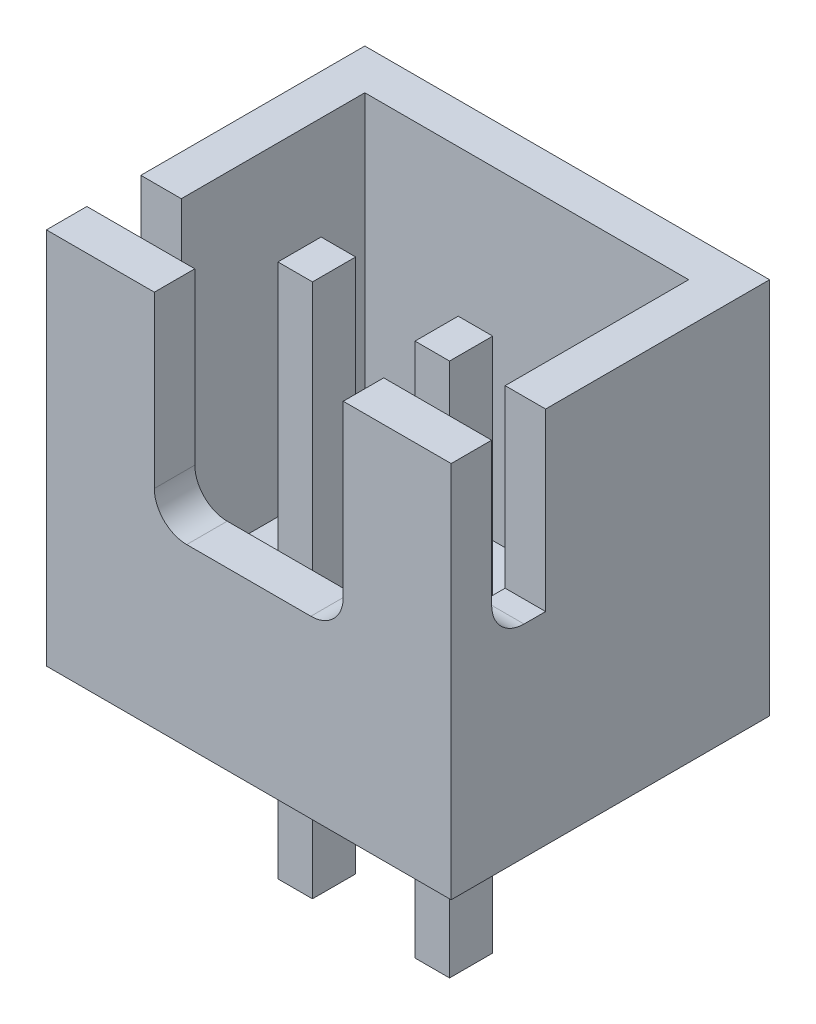
ISO-10303-21;
HEADER;
FILE_DESCRIPTION(('STEP AP214'),'2;1');
FILE_NAME('part.step','',(''),(''),'','','');
FILE_SCHEMA(('AUTOMOTIVE_DESIGN { 1 0 10303 214 1 1 1 1 }'));
ENDSEC;
DATA;
#1=APPLICATION_CONTEXT('core data for automotive mechanical design processes');
#2=APPLICATION_PROTOCOL_DEFINITION('international standard','automotive_design',2000,#1);
#3=PRODUCT_CONTEXT('',#1,'mechanical');
#4=PRODUCT('Part','Part','',(#3));
#5=PRODUCT_RELATED_PRODUCT_CATEGORY('part','',(#4));
#6=PRODUCT_DEFINITION_FORMATION('','',#4);
#7=PRODUCT_DEFINITION_CONTEXT('part definition',#1,'design');
#8=PRODUCT_DEFINITION('design','',#6,#7);
#9=PRODUCT_DEFINITION_SHAPE('','',#8);
#10=(LENGTH_UNIT() NAMED_UNIT(*) SI_UNIT(.MILLI.,.METRE.));
#11=(NAMED_UNIT(*) PLANE_ANGLE_UNIT() SI_UNIT($,.RADIAN.));
#12=(NAMED_UNIT(*) SI_UNIT($,.STERADIAN.) SOLID_ANGLE_UNIT());
#13=UNCERTAINTY_MEASURE_WITH_UNIT(LENGTH_MEASURE(1.E-05),#10,'distance_accuracy_value','');
#14=(GEOMETRIC_REPRESENTATION_CONTEXT(3) GLOBAL_UNCERTAINTY_ASSIGNED_CONTEXT((#13)) GLOBAL_UNIT_ASSIGNED_CONTEXT((#10,
#11,#12)) REPRESENTATION_CONTEXT('',''));
#15=CARTESIAN_POINT('',(0.,0.,0.));
#16=DIRECTION('',(0.,0.,1.));
#17=DIRECTION('',(1.,0.,0.));
#18=AXIS2_PLACEMENT_3D('',#15,#16,#17);
#19=CARTESIAN_POINT('',(0.,7.,0.));
#20=DIRECTION('',(0.,1.,0.));
#21=DIRECTION('',(0.,0.,1.));
#22=AXIS2_PLACEMENT_3D('',#19,#20,#21);
#23=PLANE('',#22);
#24=DIRECTION('',(1.,0.,0.));
#25=VECTOR('',#24,1.);
#26=CARTESIAN_POINT('',(-2.48,7.,2.53));
#27=LINE('',#26,#25);
#28=CARTESIAN_POINT('',(-2.48,7.,2.53));
#29=VERTEX_POINT('',#28);
#30=CARTESIAN_POINT('',(-0.48,7.,2.53));
#31=VERTEX_POINT('',#30);
#32=EDGE_CURVE('E551',#29,#31,#27,.T.);
#33=ORIENTED_EDGE('',*,*,#32,.T.);
#34=DIRECTION('',(0.,0.,1.));
#35=VECTOR('',#34,1.);
#36=CARTESIAN_POINT('',(-0.48,7.,0.53));
#37=LINE('',#36,#35);
#38=CARTESIAN_POINT('',(-0.48,7.,1.78));
#39=VERTEX_POINT('',#38);
#40=EDGE_CURVE('E428',#39,#31,#37,.T.);
#41=ORIENTED_EDGE('',*,*,#40,.F.);
#42=DIRECTION('',(1.,0.,0.));
#43=VECTOR('',#42,1.);
#44=CARTESIAN_POINT('',(-1.73,7.,1.78));
#45=LINE('',#44,#43);
#46=CARTESIAN_POINT('',(-2.48,7.,1.78));
#47=VERTEX_POINT('',#46);
#48=EDGE_CURVE('E510',#47,#39,#45,.T.);
#49=ORIENTED_EDGE('',*,*,#48,.F.);
#50=DIRECTION('',(0.,0.,1.));
#51=VECTOR('',#50,1.);
#52=CARTESIAN_POINT('',(-2.48,7.,-3.37));
#53=LINE('',#52,#51);
#54=EDGE_CURVE('E545',#47,#29,#53,.T.);
#55=ORIENTED_EDGE('',*,*,#54,.T.);
#56=EDGE_LOOP('',(#33,#41,#49,#55));
#57=FACE_BOUND('',#56,.T.);
#58=ADVANCED_FACE('F39',(#57),#23,.T.);
#59=CARTESIAN_POINT('',(5.02,1.,2.53));
#60=DIRECTION('',(0.,0.,-1.));
#61=DIRECTION('',(-1.,0.,0.));
#62=AXIS2_PLACEMENT_3D('',#59,#60,#61);
#63=PLANE('',#62);
#64=DIRECTION('',(0.,1.,0.));
#65=VECTOR('',#64,1.);
#66=CARTESIAN_POINT('',(-0.479999999999999,0.,2.53));
#67=LINE('',#66,#65);
#68=CARTESIAN_POINT('',(-0.48,3.85,2.53));
#69=VERTEX_POINT('',#68);
#70=EDGE_CURVE('E412',#69,#31,#67,.T.);
#71=ORIENTED_EDGE('',*,*,#70,.T.);
#72=ORIENTED_EDGE('',*,*,#32,.F.);
#73=DIRECTION('',(0.,-1.,0.));
#74=VECTOR('',#73,1.);
#75=CARTESIAN_POINT('',(-2.48,1.,2.53));
#76=LINE('',#75,#74);
#77=CARTESIAN_POINT('',(-2.48,0.,2.53));
#78=VERTEX_POINT('',#77);
#79=EDGE_CURVE('E646',#29,#78,#76,.T.);
#80=ORIENTED_EDGE('',*,*,#79,.T.);
#81=DIRECTION('',(1.,0.,0.));
#82=VECTOR('',#81,1.);
#83=CARTESIAN_POINT('',(5.02,0.,2.53));
#84=LINE('',#83,#82);
#85=CARTESIAN_POINT('',(5.02,0.,2.53));
#86=VERTEX_POINT('',#85);
#87=EDGE_CURVE('E625',#78,#86,#84,.T.);
#88=ORIENTED_EDGE('',*,*,#87,.T.);
#89=DIRECTION('',(0.,-1.,0.));
#90=VECTOR('',#89,1.);
#91=CARTESIAN_POINT('',(5.02,1.,2.53));
#92=LINE('',#91,#90);
#93=CARTESIAN_POINT('',(5.02,7.,2.53));
#94=VERTEX_POINT('',#93);
#95=EDGE_CURVE('E642',#94,#86,#92,.T.);
#96=ORIENTED_EDGE('',*,*,#95,.F.);
#97=CARTESIAN_POINT('',(3.02,7.,2.53));
#98=VERTEX_POINT('',#97);
#99=EDGE_CURVE('E550',#98,#94,#27,.T.);
#100=ORIENTED_EDGE('',*,*,#99,.F.);
#101=DIRECTION('',(0.,1.,0.));
#102=VECTOR('',#101,1.);
#103=CARTESIAN_POINT('',(3.02,0.,2.53));
#104=LINE('',#103,#102);
#105=CARTESIAN_POINT('',(3.02,3.85,2.53));
#106=VERTEX_POINT('',#105);
#107=EDGE_CURVE('E409',#106,#98,#104,.T.);
#108=ORIENTED_EDGE('',*,*,#107,.F.);
#109=CARTESIAN_POINT('',(2.42,3.85,2.53));
#110=DIRECTION('',(0.,0.,1.));
#111=DIRECTION('',(1.,0.,0.));
#112=AXIS2_PLACEMENT_3D('',#109,#110,#111);
#113=CIRCLE('',#112,0.6);
#114=CARTESIAN_POINT('',(2.42,3.25,2.53));
#115=VERTEX_POINT('',#114);
#116=EDGE_CURVE('E406',#115,#106,#113,.T.);
#117=ORIENTED_EDGE('',*,*,#116,.F.);
#118=DIRECTION('',(1.,0.,0.));
#119=VECTOR('',#118,1.);
#120=CARTESIAN_POINT('',(0.,3.25,2.53));
#121=LINE('',#120,#119);
#122=CARTESIAN_POINT('',(0.12,3.25,2.53));
#123=VERTEX_POINT('',#122);
#124=EDGE_CURVE('E388',#123,#115,#121,.T.);
#125=ORIENTED_EDGE('',*,*,#124,.F.);
#126=CARTESIAN_POINT('',(0.12,3.85,2.53));
#127=DIRECTION('',(0.,0.,1.));
#128=DIRECTION('',(1.,0.,0.));
#129=AXIS2_PLACEMENT_3D('',#126,#127,#128);
#130=CIRCLE('',#129,0.6);
#131=EDGE_CURVE('E416',#123,#69,#130,.F.);
#132=ORIENTED_EDGE('',*,*,#131,.T.);
#133=EDGE_LOOP('',(#71,#72,#80,#88,#96,#100,#108,#117,#125,#132));
#134=FACE_BOUND('',#133,.T.);
#135=ADVANCED_FACE('F683',(#134),#63,.F.);
#136=CARTESIAN_POINT('',(-1.73,7.,1.78));
#137=DIRECTION('',(0.,0.,-1.));
#138=DIRECTION('',(-1.,0.,0.));
#139=AXIS2_PLACEMENT_3D('',#136,#137,#138);
#140=PLANE('',#139);
#141=ORIENTED_EDGE('',*,*,#48,.T.);
#142=DIRECTION('',(0.,-1.,0.));
#143=VECTOR('',#142,1.);
#144=CARTESIAN_POINT('',(-0.48,7.,1.78));
#145=LINE('',#144,#143);
#146=CARTESIAN_POINT('',(-0.48,3.85,1.78));
#147=VERTEX_POINT('',#146);
#148=EDGE_CURVE('E11',#39,#147,#145,.T.);
#149=ORIENTED_EDGE('',*,*,#148,.T.);
#150=CARTESIAN_POINT('',(0.12,3.85,1.78));
#151=DIRECTION('',(0.,0.,-1.));
#152=DIRECTION('',(-1.,0.,0.));
#153=AXIS2_PLACEMENT_3D('',#150,#151,#152);
#154=CIRCLE('',#153,0.6);
#155=CARTESIAN_POINT('',(0.12,3.25,1.78));
#156=VERTEX_POINT('',#155);
#157=EDGE_CURVE('E48',#147,#156,#154,.F.);
#158=ORIENTED_EDGE('',*,*,#157,.T.);
#159=DIRECTION('',(-1.,0.,0.));
#160=VECTOR('',#159,1.);
#161=CARTESIAN_POINT('',(-1.73,3.25,1.78));
#162=LINE('',#161,#160);
#163=CARTESIAN_POINT('',(2.42,3.25,1.78));
#164=VERTEX_POINT('',#163);
#165=EDGE_CURVE('E663',#164,#156,#162,.T.);
#166=ORIENTED_EDGE('',*,*,#165,.F.);
#167=CARTESIAN_POINT('',(2.42,3.85,1.78));
#168=DIRECTION('',(0.,0.,-1.));
#169=DIRECTION('',(-1.,0.,0.));
#170=AXIS2_PLACEMENT_3D('',#167,#168,#169);
#171=CIRCLE('',#170,0.6);
#172=CARTESIAN_POINT('',(3.02,3.85,1.78));
#173=VERTEX_POINT('',#172);
#174=EDGE_CURVE('E657',#173,#164,#171,.T.);
#175=ORIENTED_EDGE('',*,*,#174,.F.);
#176=DIRECTION('',(0.,-1.,0.));
#177=VECTOR('',#176,1.);
#178=CARTESIAN_POINT('',(3.02,7.,1.78));
#179=LINE('',#178,#177);
#180=CARTESIAN_POINT('',(3.02,7.,1.78));
#181=VERTEX_POINT('',#180);
#182=EDGE_CURVE('E660',#181,#173,#179,.T.);
#183=ORIENTED_EDGE('',*,*,#182,.F.);
#184=CARTESIAN_POINT('',(5.02,7.,1.78));
#185=VERTEX_POINT('',#184);
#186=EDGE_CURVE('E509',#181,#185,#45,.T.);
#187=ORIENTED_EDGE('',*,*,#186,.T.);
#188=DIRECTION('',(0.,1.,0.));
#189=VECTOR('',#188,1.);
#190=CARTESIAN_POINT('',(5.02,1.,1.78));
#191=LINE('',#190,#189);
#192=CARTESIAN_POINT('',(5.02,4.35,1.78));
#193=VERTEX_POINT('',#192);
#194=EDGE_CURVE('E493',#193,#185,#191,.T.);
#195=ORIENTED_EDGE('',*,*,#194,.F.);
#196=DIRECTION('',(-1.,0.,0.));
#197=VECTOR('',#196,1.);
#198=CARTESIAN_POINT('',(6.52,4.35,1.78));
#199=LINE('',#198,#197);
#200=CARTESIAN_POINT('',(4.27,4.35,1.78));
#201=VERTEX_POINT('',#200);
#202=EDGE_CURVE('E458',#193,#201,#199,.T.);
#203=ORIENTED_EDGE('',*,*,#202,.T.);
#204=DIRECTION('',(0.,-1.,0.));
#205=VECTOR('',#204,1.);
#206=CARTESIAN_POINT('',(4.27,7.,1.78));
#207=LINE('',#206,#205);
#208=CARTESIAN_POINT('',(4.27,1.,1.78));
#209=VERTEX_POINT('',#208);
#210=EDGE_CURVE('E514',#201,#209,#207,.T.);
#211=ORIENTED_EDGE('',*,*,#210,.T.);
#212=DIRECTION('',(1.,0.,0.));
#213=VECTOR('',#212,1.);
#214=CARTESIAN_POINT('',(-1.73,1.,1.78));
#215=LINE('',#214,#213);
#216=CARTESIAN_POINT('',(-1.73,1.,1.78));
#217=VERTEX_POINT('',#216);
#218=EDGE_CURVE('E502',#217,#209,#215,.T.);
#219=ORIENTED_EDGE('',*,*,#218,.F.);
#220=DIRECTION('',(0.,-1.,0.));
#221=VECTOR('',#220,1.);
#222=CARTESIAN_POINT('',(-1.73,7.,1.78));
#223=LINE('',#222,#221);
#224=CARTESIAN_POINT('',(-1.73,4.35,1.78));
#225=VERTEX_POINT('',#224);
#226=EDGE_CURVE('E531',#225,#217,#223,.T.);
#227=ORIENTED_EDGE('',*,*,#226,.F.);
#228=CARTESIAN_POINT('',(-2.48,4.35,1.78));
#229=VERTEX_POINT('',#228);
#230=EDGE_CURVE('E455',#225,#229,#199,.T.);
#231=ORIENTED_EDGE('',*,*,#230,.T.);
#232=DIRECTION('',(0.,1.,0.));
#233=VECTOR('',#232,1.);
#234=CARTESIAN_POINT('',(-2.48,7.,1.78));
#235=LINE('',#234,#233);
#236=EDGE_CURVE('E450',#229,#47,#235,.T.);
#237=ORIENTED_EDGE('',*,*,#236,.T.);
#238=EDGE_LOOP('',(#141,#149,#158,#166,#175,#183,#187,#195,#203,#211,#219,#227,#231,#237));
#239=FACE_BOUND('',#238,.T.);
#240=ADVANCED_FACE('F669',(#239),#140,.T.);
#241=DIRECTION('',(0.,0.,1.));
#242=VECTOR('',#241,1.);
#243=CARTESIAN_POINT('',(3.02,7.,0.53));
#244=LINE('',#243,#242);
#245=EDGE_CURVE('E431',#181,#98,#244,.T.);
#246=ORIENTED_EDGE('',*,*,#245,.T.);
#247=ORIENTED_EDGE('',*,*,#99,.T.);
#248=DIRECTION('',(0.,0.,-1.));
#249=VECTOR('',#248,1.);
#250=CARTESIAN_POINT('',(5.02,7.,2.53));
#251=LINE('',#250,#249);
#252=EDGE_CURVE('E556',#94,#185,#251,.T.);
#253=ORIENTED_EDGE('',*,*,#252,.T.);
#254=ORIENTED_EDGE('',*,*,#186,.F.);
#255=EDGE_LOOP('',(#246,#247,#253,#254));
#256=FACE_BOUND('',#255,.T.);
#257=ADVANCED_FACE('F694',(#256),#23,.T.);
#258=CARTESIAN_POINT('',(0.,1.,0.));
#259=DIRECTION('',(0.,-1.,0.));
#260=DIRECTION('',(0.,0.,-1.));
#261=AXIS2_PLACEMENT_3D('',#258,#259,#260);
#262=PLANE('',#261);
#263=ORIENTED_EDGE('',*,*,#218,.T.);
#264=DIRECTION('',(0.,0.,-1.));
#265=VECTOR('',#264,1.);
#266=CARTESIAN_POINT('',(4.27,1.,1.78));
#267=LINE('',#266,#265);
#268=CARTESIAN_POINT('',(4.27,1.,-2.62));
#269=VERTEX_POINT('',#268);
#270=EDGE_CURVE('E497',#209,#269,#267,.T.);
#271=ORIENTED_EDGE('',*,*,#270,.T.);
#272=DIRECTION('',(-1.,0.,0.));
#273=VECTOR('',#272,1.);
#274=CARTESIAN_POINT('',(-1.73,1.,-2.62));
#275=LINE('',#274,#273);
#276=CARTESIAN_POINT('',(-1.73,1.,-2.62));
#277=VERTEX_POINT('',#276);
#278=EDGE_CURVE('E518',#269,#277,#275,.T.);
#279=ORIENTED_EDGE('',*,*,#278,.T.);
#280=DIRECTION('',(0.,0.,1.));
#281=VECTOR('',#280,1.);
#282=CARTESIAN_POINT('',(-1.73,1.,1.78));
#283=LINE('',#282,#281);
#284=EDGE_CURVE('E522',#277,#217,#283,.T.);
#285=ORIENTED_EDGE('',*,*,#284,.T.);
#286=EDGE_LOOP('',(#263,#271,#279,#285));
#287=FACE_BOUND('',#286,.T.);
#288=DIRECTION('',(0.,0.,-1.));
#289=VECTOR('',#288,1.);
#290=CARTESIAN_POINT('',(0.32,1.,0.4));
#291=LINE('',#290,#289);
#292=CARTESIAN_POINT('',(0.32,1.,0.4));
#293=VERTEX_POINT('',#292);
#294=CARTESIAN_POINT('',(0.32,1.,-0.4));
#295=VERTEX_POINT('',#294);
#296=EDGE_CURVE('E292',#293,#295,#291,.T.);
#297=ORIENTED_EDGE('',*,*,#296,.F.);
#298=DIRECTION('',(1.,0.,0.));
#299=VECTOR('',#298,1.);
#300=CARTESIAN_POINT('',(-0.32,1.,0.4));
#301=LINE('',#300,#299);
#302=CARTESIAN_POINT('',(-0.32,1.,0.4));
#303=VERTEX_POINT('',#302);
#304=EDGE_CURVE('E603',#303,#293,#301,.T.);
#305=ORIENTED_EDGE('',*,*,#304,.F.);
#306=DIRECTION('',(0.,0.,1.));
#307=VECTOR('',#306,1.);
#308=CARTESIAN_POINT('',(-0.32,1.,0.4));
#309=LINE('',#308,#307);
#310=CARTESIAN_POINT('',(-0.32,1.,-0.4));
#311=VERTEX_POINT('',#310);
#312=EDGE_CURVE('E599',#311,#303,#309,.T.);
#313=ORIENTED_EDGE('',*,*,#312,.F.);
#314=DIRECTION('',(-1.,0.,0.));
#315=VECTOR('',#314,1.);
#316=CARTESIAN_POINT('',(-0.32,1.,-0.4));
#317=LINE('',#316,#315);
#318=EDGE_CURVE('E595',#295,#311,#317,.T.);
#319=ORIENTED_EDGE('',*,*,#318,.F.);
#320=EDGE_LOOP('',(#297,#305,#313,#319));
#321=FACE_BOUND('',#320,.T.);
#322=DIRECTION('',(1.,0.,0.));
#323=VECTOR('',#322,1.);
#324=CARTESIAN_POINT('',(2.86,1.,0.4));
#325=LINE('',#324,#323);
#326=CARTESIAN_POINT('',(2.22,1.,0.4));
#327=VERTEX_POINT('',#326);
#328=CARTESIAN_POINT('',(2.86,1.,0.4));
#329=VERTEX_POINT('',#328);
#330=EDGE_CURVE('E561',#327,#329,#325,.T.);
#331=ORIENTED_EDGE('',*,*,#330,.F.);
#332=DIRECTION('',(0.,0.,1.));
#333=VECTOR('',#332,1.);
#334=CARTESIAN_POINT('',(2.22,1.,0.4));
#335=LINE('',#334,#333);
#336=CARTESIAN_POINT('',(2.22,1.,-0.4));
#337=VERTEX_POINT('',#336);
#338=EDGE_CURVE('E574',#337,#327,#335,.T.);
#339=ORIENTED_EDGE('',*,*,#338,.F.);
#340=DIRECTION('',(-1.,0.,0.));
#341=VECTOR('',#340,1.);
#342=CARTESIAN_POINT('',(2.86,1.,-0.4));
#343=LINE('',#342,#341);
#344=CARTESIAN_POINT('',(2.86,1.,-0.4));
#345=VERTEX_POINT('',#344);
#346=EDGE_CURVE('E570',#345,#337,#343,.T.);
#347=ORIENTED_EDGE('',*,*,#346,.F.);
#348=DIRECTION('',(0.,0.,-1.));
#349=VECTOR('',#348,1.);
#350=CARTESIAN_POINT('',(2.86,1.,0.4));
#351=LINE('',#350,#349);
#352=EDGE_CURVE('E565',#329,#345,#351,.T.);
#353=ORIENTED_EDGE('',*,*,#352,.F.);
#354=EDGE_LOOP('',(#331,#339,#347,#353));
#355=FACE_BOUND('',#354,.T.);
#356=ADVANCED_FACE('F718',(#287,#321,#355),#262,.F.);
#357=CARTESIAN_POINT('',(0.,0.,0.));
#358=DIRECTION('',(0.,-1.,0.));
#359=DIRECTION('',(0.,0.,-1.));
#360=AXIS2_PLACEMENT_3D('',#357,#358,#359);
#361=PLANE('',#360);
#362=DIRECTION('',(0.,0.,1.));
#363=VECTOR('',#362,1.);
#364=CARTESIAN_POINT('',(-2.48,0.,2.53));
#365=LINE('',#364,#363);
#366=CARTESIAN_POINT('',(-2.48,0.,-3.37));
#367=VERTEX_POINT('',#366);
#368=EDGE_CURVE('E607',#367,#78,#365,.T.);
#369=ORIENTED_EDGE('',*,*,#368,.F.);
#370=DIRECTION('',(-1.,0.,0.));
#371=VECTOR('',#370,1.);
#372=CARTESIAN_POINT('',(-2.48,0.,-3.37));
#373=LINE('',#372,#371);
#374=CARTESIAN_POINT('',(5.02,0.,-3.37));
#375=VERTEX_POINT('',#374);
#376=EDGE_CURVE('E631',#375,#367,#373,.T.);
#377=ORIENTED_EDGE('',*,*,#376,.F.);
#378=DIRECTION('',(0.,0.,-1.));
#379=VECTOR('',#378,1.);
#380=CARTESIAN_POINT('',(5.02,0.,-3.37));
#381=LINE('',#380,#379);
#382=EDGE_CURVE('E628',#86,#375,#381,.T.);
#383=ORIENTED_EDGE('',*,*,#382,.F.);
#384=ORIENTED_EDGE('',*,*,#87,.F.);
#385=EDGE_LOOP('',(#369,#377,#383,#384));
#386=FACE_BOUND('',#385,.T.);
#387=DIRECTION('',(1.,0.,0.));
#388=VECTOR('',#387,1.);
#389=CARTESIAN_POINT('',(-0.32,0.,0.4));
#390=LINE('',#389,#388);
#391=CARTESIAN_POINT('',(-0.32,0.,0.4));
#392=VERTEX_POINT('',#391);
#393=CARTESIAN_POINT('',(0.32,0.,0.4));
#394=VERTEX_POINT('',#393);
#395=EDGE_CURVE('E596',#392,#394,#390,.T.);
#396=ORIENTED_EDGE('',*,*,#395,.T.);
#397=DIRECTION('',(0.,0.,-1.));
#398=VECTOR('',#397,1.);
#399=CARTESIAN_POINT('',(0.32,0.,0.4));
#400=LINE('',#399,#398);
#401=CARTESIAN_POINT('',(0.32,0.,-0.4));
#402=VERTEX_POINT('',#401);
#403=EDGE_CURVE('E578',#394,#402,#400,.T.);
#404=ORIENTED_EDGE('',*,*,#403,.T.);
#405=DIRECTION('',(-1.,0.,0.));
#406=VECTOR('',#405,1.);
#407=CARTESIAN_POINT('',(-0.32,0.,-0.4));
#408=LINE('',#407,#406);
#409=CARTESIAN_POINT('',(-0.32,0.,-0.4));
#410=VERTEX_POINT('',#409);
#411=EDGE_CURVE('E611',#402,#410,#408,.T.);
#412=ORIENTED_EDGE('',*,*,#411,.T.);
#413=DIRECTION('',(0.,0.,1.));
#414=VECTOR('',#413,1.);
#415=CARTESIAN_POINT('',(-0.32,0.,0.4));
#416=LINE('',#415,#414);
#417=EDGE_CURVE('E615',#410,#392,#416,.T.);
#418=ORIENTED_EDGE('',*,*,#417,.T.);
#419=EDGE_LOOP('',(#396,#404,#412,#418));
#420=FACE_BOUND('',#419,.T.);
#421=DIRECTION('',(0.,0.,1.));
#422=VECTOR('',#421,1.);
#423=CARTESIAN_POINT('',(2.22,0.,0.4));
#424=LINE('',#423,#422);
#425=CARTESIAN_POINT('',(2.22,0.,-0.4));
#426=VERTEX_POINT('',#425);
#427=CARTESIAN_POINT('',(2.22,0.,0.4));
#428=VERTEX_POINT('',#427);
#429=EDGE_CURVE('E566',#426,#428,#424,.T.);
#430=ORIENTED_EDGE('',*,*,#429,.T.);
#431=DIRECTION('',(1.,0.,0.));
#432=VECTOR('',#431,1.);
#433=CARTESIAN_POINT('',(2.86,0.,0.4));
#434=LINE('',#433,#432);
#435=CARTESIAN_POINT('',(2.86,0.,0.4));
#436=VERTEX_POINT('',#435);
#437=EDGE_CURVE('E560',#428,#436,#434,.T.);
#438=ORIENTED_EDGE('',*,*,#437,.T.);
#439=DIRECTION('',(0.,0.,-1.));
#440=VECTOR('',#439,1.);
#441=CARTESIAN_POINT('',(2.86,0.,0.4));
#442=LINE('',#441,#440);
#443=CARTESIAN_POINT('',(2.86,0.,-0.4));
#444=VERTEX_POINT('',#443);
#445=EDGE_CURVE('E582',#436,#444,#442,.T.);
#446=ORIENTED_EDGE('',*,*,#445,.T.);
#447=DIRECTION('',(-1.,0.,0.));
#448=VECTOR('',#447,1.);
#449=CARTESIAN_POINT('',(2.86,0.,-0.4));
#450=LINE('',#449,#448);
#451=EDGE_CURVE('E586',#444,#426,#450,.T.);
#452=ORIENTED_EDGE('',*,*,#451,.T.);
#453=EDGE_LOOP('',(#430,#438,#446,#452));
#454=FACE_BOUND('',#453,.T.);
#455=ADVANCED_FACE('F721',(#386,#420,#454),#361,.T.);
#456=CARTESIAN_POINT('',(-2.48,1.,2.53));
#457=DIRECTION('',(1.,0.,0.));
#458=DIRECTION('',(0.,0.,-1.));
#459=AXIS2_PLACEMENT_3D('',#456,#457,#458);
#460=PLANE('',#459);
#461=ORIENTED_EDGE('',*,*,#54,.F.);
#462=ORIENTED_EDGE('',*,*,#236,.F.);
#463=CARTESIAN_POINT('',(-2.48,4.35,1.18));
#464=DIRECTION('',(-1.,0.,0.));
#465=DIRECTION('',(0.,0.,1.));
#466=AXIS2_PLACEMENT_3D('',#463,#464,#465);
#467=CIRCLE('',#466,0.6);
#468=CARTESIAN_POINT('',(-2.48,3.75,1.18));
#469=VERTEX_POINT('',#468);
#470=EDGE_CURVE('E446',#469,#229,#467,.T.);
#471=ORIENTED_EDGE('',*,*,#470,.F.);
#472=DIRECTION('',(0.,0.,1.));
#473=VECTOR('',#472,1.);
#474=CARTESIAN_POINT('',(-2.48,3.75,1.18));
#475=LINE('',#474,#473);
#476=CARTESIAN_POINT('',(-2.48,3.75,0.780000000000001));
#477=VERTEX_POINT('',#476);
#478=EDGE_CURVE('E442',#477,#469,#475,.T.);
#479=ORIENTED_EDGE('',*,*,#478,.F.);
#480=DIRECTION('',(0.,-1.,0.));
#481=VECTOR('',#480,1.);
#482=CARTESIAN_POINT('',(-2.48,3.75,0.780000000000001));
#483=LINE('',#482,#481);
#484=CARTESIAN_POINT('',(-2.48,7.,0.780000000000001));
#485=VERTEX_POINT('',#484);
#486=EDGE_CURVE('E424',#485,#477,#483,.T.);
#487=ORIENTED_EDGE('',*,*,#486,.F.);
#488=CARTESIAN_POINT('',(-2.48,7.,-3.37));
#489=VERTEX_POINT('',#488);
#490=EDGE_CURVE('E546',#489,#485,#53,.T.);
#491=ORIENTED_EDGE('',*,*,#490,.F.);
#492=DIRECTION('',(0.,-1.,0.));
#493=VECTOR('',#492,1.);
#494=CARTESIAN_POINT('',(-2.48,1.,-3.37));
#495=LINE('',#494,#493);
#496=EDGE_CURVE('E634',#489,#367,#495,.T.);
#497=ORIENTED_EDGE('',*,*,#496,.T.);
#498=ORIENTED_EDGE('',*,*,#368,.T.);
#499=ORIENTED_EDGE('',*,*,#79,.F.);
#500=EDGE_LOOP('',(#461,#462,#471,#479,#487,#491,#497,#498,#499));
#501=FACE_BOUND('',#500,.T.);
#502=ADVANCED_FACE('F41',(#501),#460,.F.);
#503=CARTESIAN_POINT('',(5.02,1.,-3.37));
#504=DIRECTION('',(-1.,0.,0.));
#505=DIRECTION('',(0.,0.,1.));
#506=AXIS2_PLACEMENT_3D('',#503,#504,#505);
#507=PLANE('',#506);
#508=CARTESIAN_POINT('',(5.02,4.35,1.18));
#509=DIRECTION('',(-1.,0.,0.));
#510=DIRECTION('',(0.,0.,1.));
#511=AXIS2_PLACEMENT_3D('',#508,#509,#510);
#512=CIRCLE('',#511,0.6);
#513=CARTESIAN_POINT('',(5.02,3.75,1.18));
#514=VERTEX_POINT('',#513);
#515=EDGE_CURVE('E475',#514,#193,#512,.T.);
#516=ORIENTED_EDGE('',*,*,#515,.T.);
#517=ORIENTED_EDGE('',*,*,#194,.T.);
#518=ORIENTED_EDGE('',*,*,#252,.F.);
#519=ORIENTED_EDGE('',*,*,#95,.T.);
#520=ORIENTED_EDGE('',*,*,#382,.T.);
#521=DIRECTION('',(0.,-1.,0.));
#522=VECTOR('',#521,1.);
#523=CARTESIAN_POINT('',(5.02,1.,-3.37));
#524=LINE('',#523,#522);
#525=CARTESIAN_POINT('',(5.02,7.,-3.37));
#526=VERTEX_POINT('',#525);
#527=EDGE_CURVE('E638',#526,#375,#524,.T.);
#528=ORIENTED_EDGE('',*,*,#527,.F.);
#529=CARTESIAN_POINT('',(5.02,7.,0.780000000000001));
#530=VERTEX_POINT('',#529);
#531=EDGE_CURVE('E555',#530,#526,#251,.T.);
#532=ORIENTED_EDGE('',*,*,#531,.F.);
#533=DIRECTION('',(0.,-1.,0.));
#534=VECTOR('',#533,1.);
#535=CARTESIAN_POINT('',(5.02,1.,0.780000000000001));
#536=LINE('',#535,#534);
#537=CARTESIAN_POINT('',(5.02,3.75,0.780000000000001));
#538=VERTEX_POINT('',#537);
#539=EDGE_CURVE('E482',#530,#538,#536,.T.);
#540=ORIENTED_EDGE('',*,*,#539,.T.);
#541=DIRECTION('',(0.,0.,1.));
#542=VECTOR('',#541,1.);
#543=CARTESIAN_POINT('',(5.02,3.75,-3.37));
#544=LINE('',#543,#542);
#545=EDGE_CURVE('E489',#538,#514,#544,.T.);
#546=ORIENTED_EDGE('',*,*,#545,.T.);
#547=EDGE_LOOP('',(#516,#517,#518,#519,#520,#528,#532,#540,#546));
#548=FACE_BOUND('',#547,.T.);
#549=ADVANCED_FACE('F777',(#548),#507,.F.);
#550=CARTESIAN_POINT('',(-2.48,1.,-3.37));
#551=DIRECTION('',(0.,0.,1.));
#552=DIRECTION('',(1.,0.,0.));
#553=AXIS2_PLACEMENT_3D('',#550,#551,#552);
#554=PLANE('',#553);
#555=ORIENTED_EDGE('',*,*,#376,.T.);
#556=ORIENTED_EDGE('',*,*,#496,.F.);
#557=DIRECTION('',(-1.,0.,0.));
#558=VECTOR('',#557,1.);
#559=CARTESIAN_POINT('',(5.02,7.,-3.37));
#560=LINE('',#559,#558);
#561=EDGE_CURVE('E541',#526,#489,#560,.T.);
#562=ORIENTED_EDGE('',*,*,#561,.F.);
#563=ORIENTED_EDGE('',*,*,#527,.T.);
#564=EDGE_LOOP('',(#555,#556,#562,#563));
#565=FACE_BOUND('',#564,.T.);
#566=ADVANCED_FACE('F769',(#565),#554,.F.);
#567=DIRECTION('',(-1.,0.,0.));
#568=VECTOR('',#567,1.);
#569=CARTESIAN_POINT('',(6.52,7.,0.780000000000001));
#570=LINE('',#569,#568);
#571=CARTESIAN_POINT('',(4.27,7.,0.780000000000001));
#572=VERTEX_POINT('',#571);
#573=EDGE_CURVE('E63',#530,#572,#570,.T.);
#574=ORIENTED_EDGE('',*,*,#573,.F.);
#575=ORIENTED_EDGE('',*,*,#531,.T.);
#576=ORIENTED_EDGE('',*,*,#561,.T.);
#577=ORIENTED_EDGE('',*,*,#490,.T.);
#578=CARTESIAN_POINT('',(-1.73,7.,0.780000000000001));
#579=VERTEX_POINT('',#578);
#580=EDGE_CURVE('E454',#579,#485,#570,.T.);
#581=ORIENTED_EDGE('',*,*,#580,.F.);
#582=DIRECTION('',(0.,0.,1.));
#583=VECTOR('',#582,1.);
#584=CARTESIAN_POINT('',(-1.73,7.,1.78));
#585=LINE('',#584,#583);
#586=CARTESIAN_POINT('',(-1.73,7.,-2.62));
#587=VERTEX_POINT('',#586);
#588=EDGE_CURVE('E505',#587,#579,#585,.T.);
#589=ORIENTED_EDGE('',*,*,#588,.F.);
#590=DIRECTION('',(-1.,0.,0.));
#591=VECTOR('',#590,1.);
#592=CARTESIAN_POINT('',(-1.73,7.,-2.62));
#593=LINE('',#592,#591);
#594=CARTESIAN_POINT('',(4.27,7.,-2.62));
#595=VERTEX_POINT('',#594);
#596=EDGE_CURVE('E501',#595,#587,#593,.T.);
#597=ORIENTED_EDGE('',*,*,#596,.F.);
#598=DIRECTION('',(0.,0.,-1.));
#599=VECTOR('',#598,1.);
#600=CARTESIAN_POINT('',(4.27,7.,1.78));
#601=LINE('',#600,#599);
#602=EDGE_CURVE('E498',#572,#595,#601,.T.);
#603=ORIENTED_EDGE('',*,*,#602,.F.);
#604=EDGE_LOOP('',(#574,#575,#576,#577,#581,#589,#597,#603));
#605=FACE_BOUND('',#604,.T.);
#606=ADVANCED_FACE('F761',(#605),#23,.T.);
#607=CARTESIAN_POINT('',(4.27,7.,1.78));
#608=DIRECTION('',(-1.,0.,0.));
#609=DIRECTION('',(0.,0.,1.));
#610=AXIS2_PLACEMENT_3D('',#607,#608,#609);
#611=PLANE('',#610);
#612=CARTESIAN_POINT('',(4.27,4.35,1.18));
#613=DIRECTION('',(-1.,0.,0.));
#614=DIRECTION('',(0.,0.,1.));
#615=AXIS2_PLACEMENT_3D('',#612,#613,#614);
#616=CIRCLE('',#615,0.6);
#617=CARTESIAN_POINT('',(4.27,3.75,1.18));
#618=VERTEX_POINT('',#617);
#619=EDGE_CURVE('E472',#618,#201,#616,.T.);
#620=ORIENTED_EDGE('',*,*,#619,.F.);
#621=DIRECTION('',(0.,0.,1.));
#622=VECTOR('',#621,1.);
#623=CARTESIAN_POINT('',(4.27,3.75,1.78));
#624=LINE('',#623,#622);
#625=CARTESIAN_POINT('',(4.27,3.75,0.780000000000001));
#626=VERTEX_POINT('',#625);
#627=EDGE_CURVE('E486',#626,#618,#624,.T.);
#628=ORIENTED_EDGE('',*,*,#627,.F.);
#629=DIRECTION('',(0.,-1.,0.));
#630=VECTOR('',#629,1.);
#631=CARTESIAN_POINT('',(4.27,7.,0.780000000000001));
#632=LINE('',#631,#630);
#633=EDGE_CURVE('E479',#572,#626,#632,.T.);
#634=ORIENTED_EDGE('',*,*,#633,.F.);
#635=ORIENTED_EDGE('',*,*,#602,.T.);
#636=DIRECTION('',(0.,-1.,0.));
#637=VECTOR('',#636,1.);
#638=CARTESIAN_POINT('',(4.27,7.,-2.62));
#639=LINE('',#638,#637);
#640=EDGE_CURVE('E537',#595,#269,#639,.T.);
#641=ORIENTED_EDGE('',*,*,#640,.T.);
#642=ORIENTED_EDGE('',*,*,#270,.F.);
#643=ORIENTED_EDGE('',*,*,#210,.F.);
#644=EDGE_LOOP('',(#620,#628,#634,#635,#641,#642,#643));
#645=FACE_BOUND('',#644,.T.);
#646=ADVANCED_FACE('F768',(#645),#611,.T.);
#647=CARTESIAN_POINT('',(-1.73,7.,-2.62));
#648=DIRECTION('',(0.,0.,1.));
#649=DIRECTION('',(1.,0.,0.));
#650=AXIS2_PLACEMENT_3D('',#647,#648,#649);
#651=PLANE('',#650);
#652=ORIENTED_EDGE('',*,*,#278,.F.);
#653=ORIENTED_EDGE('',*,*,#640,.F.);
#654=ORIENTED_EDGE('',*,*,#596,.T.);
#655=DIRECTION('',(0.,-1.,0.));
#656=VECTOR('',#655,1.);
#657=CARTESIAN_POINT('',(-1.73,7.,-2.62));
#658=LINE('',#657,#656);
#659=EDGE_CURVE('E534',#587,#277,#658,.T.);
#660=ORIENTED_EDGE('',*,*,#659,.T.);
#661=EDGE_LOOP('',(#652,#653,#654,#660));
#662=FACE_BOUND('',#661,.T.);
#663=ADVANCED_FACE('F775',(#662),#651,.T.);
#664=CARTESIAN_POINT('',(-1.73,7.,1.78));
#665=DIRECTION('',(1.,0.,0.));
#666=DIRECTION('',(0.,0.,-1.));
#667=AXIS2_PLACEMENT_3D('',#664,#665,#666);
#668=PLANE('',#667);
#669=CARTESIAN_POINT('',(-1.73,4.35,1.18));
#670=DIRECTION('',(1.,0.,0.));
#671=DIRECTION('',(0.,0.,-1.));
#672=AXIS2_PLACEMENT_3D('',#669,#670,#671);
#673=CIRCLE('',#672,0.6);
#674=CARTESIAN_POINT('',(-1.73,3.75,1.18));
#675=VERTEX_POINT('',#674);
#676=EDGE_CURVE('E469',#225,#675,#673,.T.);
#677=ORIENTED_EDGE('',*,*,#676,.F.);
#678=ORIENTED_EDGE('',*,*,#226,.T.);
#679=ORIENTED_EDGE('',*,*,#284,.F.);
#680=ORIENTED_EDGE('',*,*,#659,.F.);
#681=ORIENTED_EDGE('',*,*,#588,.T.);
#682=DIRECTION('',(0.,1.,0.));
#683=VECTOR('',#682,1.);
#684=CARTESIAN_POINT('',(-1.73,7.,0.780000000000001));
#685=LINE('',#684,#683);
#686=CARTESIAN_POINT('',(-1.73,3.75,0.780000000000001));
#687=VERTEX_POINT('',#686);
#688=EDGE_CURVE('E650',#687,#579,#685,.T.);
#689=ORIENTED_EDGE('',*,*,#688,.F.);
#690=DIRECTION('',(0.,0.,-1.));
#691=VECTOR('',#690,1.);
#692=CARTESIAN_POINT('',(-1.73,3.75,1.78));
#693=LINE('',#692,#691);
#694=EDGE_CURVE('E653',#675,#687,#693,.T.);
#695=ORIENTED_EDGE('',*,*,#694,.F.);
#696=EDGE_LOOP('',(#677,#678,#679,#680,#681,#689,#695));
#697=FACE_BOUND('',#696,.T.);
#698=ADVANCED_FACE('F809',(#697),#668,.T.);
#699=CARTESIAN_POINT('',(6.52,3.75,0.780000000000001));
#700=DIRECTION('',(0.,0.,-1.));
#701=DIRECTION('',(0.,1.,0.));
#702=AXIS2_PLACEMENT_3D('',#699,#700,#701);
#703=PLANE('',#702);
#704=ORIENTED_EDGE('',*,*,#688,.T.);
#705=ORIENTED_EDGE('',*,*,#580,.T.);
#706=ORIENTED_EDGE('',*,*,#486,.T.);
#707=DIRECTION('',(-1.,0.,0.));
#708=VECTOR('',#707,1.);
#709=CARTESIAN_POINT('',(6.52,3.75,0.780000000000001));
#710=LINE('',#709,#708);
#711=EDGE_CURVE('E464',#687,#477,#710,.T.);
#712=ORIENTED_EDGE('',*,*,#711,.F.);
#713=EDGE_LOOP('',(#704,#705,#706,#712));
#714=FACE_BOUND('',#713,.T.);
#715=ADVANCED_FACE('F830',(#714),#703,.F.);
#716=CARTESIAN_POINT('',(6.52,3.75,1.18));
#717=DIRECTION('',(0.,-1.,0.));
#718=DIRECTION('',(0.,0.,-1.));
#719=AXIS2_PLACEMENT_3D('',#716,#717,#718);
#720=PLANE('',#719);
#721=ORIENTED_EDGE('',*,*,#694,.T.);
#722=ORIENTED_EDGE('',*,*,#711,.T.);
#723=ORIENTED_EDGE('',*,*,#478,.T.);
#724=DIRECTION('',(-1.,0.,0.));
#725=VECTOR('',#724,1.);
#726=CARTESIAN_POINT('',(6.52,3.75,1.18));
#727=LINE('',#726,#725);
#728=EDGE_CURVE('E460',#675,#469,#727,.T.);
#729=ORIENTED_EDGE('',*,*,#728,.F.);
#730=EDGE_LOOP('',(#721,#722,#723,#729));
#731=FACE_BOUND('',#730,.T.);
#732=ADVANCED_FACE('F838',(#731),#720,.F.);
#733=CARTESIAN_POINT('',(6.52,4.35,1.18));
#734=DIRECTION('',(-1.,0.,0.));
#735=DIRECTION('',(0.,0.,1.));
#736=AXIS2_PLACEMENT_3D('',#733,#734,#735);
#737=CYLINDRICAL_SURFACE('',#736,0.6);
#738=ORIENTED_EDGE('',*,*,#676,.T.);
#739=ORIENTED_EDGE('',*,*,#728,.T.);
#740=ORIENTED_EDGE('',*,*,#470,.T.);
#741=ORIENTED_EDGE('',*,*,#230,.F.);
#742=EDGE_LOOP('',(#738,#739,#740,#741));
#743=FACE_BOUND('',#742,.T.);
#744=ADVANCED_FACE('F836',(#743),#737,.F.);
#745=EDGE_CURVE('E463',#538,#626,#710,.T.);
#746=ORIENTED_EDGE('',*,*,#745,.T.);
#747=ORIENTED_EDGE('',*,*,#627,.T.);
#748=EDGE_CURVE('E459',#514,#618,#727,.T.);
#749=ORIENTED_EDGE('',*,*,#748,.F.);
#750=ORIENTED_EDGE('',*,*,#545,.F.);
#751=EDGE_LOOP('',(#746,#747,#749,#750));
#752=FACE_BOUND('',#751,.T.);
#753=ADVANCED_FACE('F825',(#752),#720,.F.);
#754=ORIENTED_EDGE('',*,*,#573,.T.);
#755=ORIENTED_EDGE('',*,*,#633,.T.);
#756=ORIENTED_EDGE('',*,*,#745,.F.);
#757=ORIENTED_EDGE('',*,*,#539,.F.);
#758=EDGE_LOOP('',(#754,#755,#756,#757));
#759=FACE_BOUND('',#758,.T.);
#760=ADVANCED_FACE('F827',(#759),#703,.F.);
#761=ORIENTED_EDGE('',*,*,#748,.T.);
#762=ORIENTED_EDGE('',*,*,#619,.T.);
#763=ORIENTED_EDGE('',*,*,#202,.F.);
#764=ORIENTED_EDGE('',*,*,#515,.F.);
#765=EDGE_LOOP('',(#761,#762,#763,#764));
#766=FACE_BOUND('',#765,.T.);
#767=ADVANCED_FACE('F822',(#766),#737,.F.);
#768=CARTESIAN_POINT('',(0.,3.25,0.53));
#769=DIRECTION('',(0.,-1.,0.));
#770=DIRECTION('',(1.,0.,0.));
#771=AXIS2_PLACEMENT_3D('',#768,#769,#770);
#772=PLANE('',#771);
#773=ORIENTED_EDGE('',*,*,#165,.T.);
#774=DIRECTION('',(0.,0.,1.));
#775=VECTOR('',#774,1.);
#776=CARTESIAN_POINT('',(0.12,3.25,0.53));
#777=LINE('',#776,#775);
#778=EDGE_CURVE('E421',#156,#123,#777,.T.);
#779=ORIENTED_EDGE('',*,*,#778,.T.);
#780=ORIENTED_EDGE('',*,*,#124,.T.);
#781=DIRECTION('',(0.,0.,1.));
#782=VECTOR('',#781,1.);
#783=CARTESIAN_POINT('',(2.42,3.25,0.53));
#784=LINE('',#783,#782);
#785=EDGE_CURVE('E420',#164,#115,#784,.T.);
#786=ORIENTED_EDGE('',*,*,#785,.F.);
#787=EDGE_LOOP('',(#773,#779,#780,#786));
#788=FACE_BOUND('',#787,.T.);
#789=ADVANCED_FACE('F688',(#788),#772,.F.);
#790=CARTESIAN_POINT('',(0.12,3.85,0.53));
#791=DIRECTION('',(0.,0.,1.));
#792=DIRECTION('',(1.,0.,0.));
#793=AXIS2_PLACEMENT_3D('',#790,#791,#792);
#794=CYLINDRICAL_SURFACE('',#793,0.6);
#795=DIRECTION('',(0.,0.,1.));
#796=VECTOR('',#795,1.);
#797=CARTESIAN_POINT('',(-0.48,3.85,0.53));
#798=LINE('',#797,#796);
#799=EDGE_CURVE('E425',#147,#69,#798,.T.);
#800=ORIENTED_EDGE('',*,*,#799,.T.);
#801=ORIENTED_EDGE('',*,*,#131,.F.);
#802=ORIENTED_EDGE('',*,*,#778,.F.);
#803=ORIENTED_EDGE('',*,*,#157,.F.);
#804=EDGE_LOOP('',(#800,#801,#802,#803));
#805=FACE_BOUND('',#804,.T.);
#806=ADVANCED_FACE('F674',(#805),#794,.F.);
#807=CARTESIAN_POINT('',(-0.479999999999999,0.,0.53));
#808=DIRECTION('',(1.,0.,0.));
#809=DIRECTION('',(0.,1.,0.));
#810=AXIS2_PLACEMENT_3D('',#807,#808,#809);
#811=PLANE('',#810);
#812=ORIENTED_EDGE('',*,*,#40,.T.);
#813=ORIENTED_EDGE('',*,*,#70,.F.);
#814=ORIENTED_EDGE('',*,*,#799,.F.);
#815=ORIENTED_EDGE('',*,*,#148,.F.);
#816=EDGE_LOOP('',(#812,#813,#814,#815));
#817=FACE_BOUND('',#816,.T.);
#818=ADVANCED_FACE('F678',(#817),#811,.T.);
#819=CARTESIAN_POINT('',(3.02,0.,0.53));
#820=DIRECTION('',(1.,0.,0.));
#821=DIRECTION('',(0.,0.,-1.));
#822=AXIS2_PLACEMENT_3D('',#819,#820,#821);
#823=PLANE('',#822);
#824=ORIENTED_EDGE('',*,*,#182,.T.);
#825=DIRECTION('',(0.,0.,1.));
#826=VECTOR('',#825,1.);
#827=CARTESIAN_POINT('',(3.02,3.85,0.53));
#828=LINE('',#827,#826);
#829=EDGE_CURVE('E55',#173,#106,#828,.T.);
#830=ORIENTED_EDGE('',*,*,#829,.T.);
#831=ORIENTED_EDGE('',*,*,#107,.T.);
#832=ORIENTED_EDGE('',*,*,#245,.F.);
#833=EDGE_LOOP('',(#824,#830,#831,#832));
#834=FACE_BOUND('',#833,.T.);
#835=ADVANCED_FACE('F858',(#834),#823,.F.);
#836=CARTESIAN_POINT('',(2.42,3.85,0.53));
#837=DIRECTION('',(0.,0.,1.));
#838=DIRECTION('',(1.,0.,0.));
#839=AXIS2_PLACEMENT_3D('',#836,#837,#838);
#840=CYLINDRICAL_SURFACE('',#839,0.6);
#841=ORIENTED_EDGE('',*,*,#174,.T.);
#842=ORIENTED_EDGE('',*,*,#785,.T.);
#843=ORIENTED_EDGE('',*,*,#116,.T.);
#844=ORIENTED_EDGE('',*,*,#829,.F.);
#845=EDGE_LOOP('',(#841,#842,#843,#844));
#846=FACE_BOUND('',#845,.T.);
#847=ADVANCED_FACE('F689',(#846),#840,.F.);
#848=CARTESIAN_POINT('',(0.,-3.4,0.));
#849=DIRECTION('',(0.,1.,0.));
#850=DIRECTION('',(0.,0.,1.));
#851=AXIS2_PLACEMENT_3D('',#848,#849,#850);
#852=PLANE('',#851);
#853=DIRECTION('',(1.,0.,0.));
#854=VECTOR('',#853,1.);
#855=CARTESIAN_POINT('',(2.22,-3.4,0.4));
#856=LINE('',#855,#854);
#857=CARTESIAN_POINT('',(2.22,-3.4,0.4));
#858=VERTEX_POINT('',#857);
#859=CARTESIAN_POINT('',(2.86,-3.4,0.4));
#860=VERTEX_POINT('',#859);
#861=EDGE_CURVE('E367',#858,#860,#856,.T.);
#862=ORIENTED_EDGE('',*,*,#861,.F.);
#863=DIRECTION('',(0.,0.,1.));
#864=VECTOR('',#863,1.);
#865=CARTESIAN_POINT('',(2.22,-3.4,-0.4));
#866=LINE('',#865,#864);
#867=CARTESIAN_POINT('',(2.22,-3.4,-0.4));
#868=VERTEX_POINT('',#867);
#869=EDGE_CURVE('E379',#868,#858,#866,.T.);
#870=ORIENTED_EDGE('',*,*,#869,.F.);
#871=DIRECTION('',(-1.,0.,0.));
#872=VECTOR('',#871,1.);
#873=CARTESIAN_POINT('',(2.86,-3.4,-0.4));
#874=LINE('',#873,#872);
#875=CARTESIAN_POINT('',(2.86,-3.4,-0.4));
#876=VERTEX_POINT('',#875);
#877=EDGE_CURVE('E375',#876,#868,#874,.T.);
#878=ORIENTED_EDGE('',*,*,#877,.F.);
#879=DIRECTION('',(0.,0.,-1.));
#880=VECTOR('',#879,1.);
#881=CARTESIAN_POINT('',(2.86,-3.4,0.4));
#882=LINE('',#881,#880);
#883=EDGE_CURVE('E371',#860,#876,#882,.T.);
#884=ORIENTED_EDGE('',*,*,#883,.F.);
#885=EDGE_LOOP('',(#862,#870,#878,#884));
#886=FACE_BOUND('',#885,.T.);
#887=ADVANCED_FACE('F756',(#886),#852,.F.);
#888=CARTESIAN_POINT('',(2.86,-3.4,0.4));
#889=DIRECTION('',(1.,0.,0.));
#890=DIRECTION('',(0.,0.,-1.));
#891=AXIS2_PLACEMENT_3D('',#888,#889,#890);
#892=PLANE('',#891);
#893=DIRECTION('',(0.,1.,0.));
#894=VECTOR('',#893,1.);
#895=CARTESIAN_POINT('',(2.86,-3.4,-0.4));
#896=LINE('',#895,#894);
#897=EDGE_CURVE('E395',#876,#444,#896,.T.);
#898=ORIENTED_EDGE('',*,*,#897,.T.);
#899=ORIENTED_EDGE('',*,*,#445,.F.);
#900=DIRECTION('',(0.,1.,0.));
#901=VECTOR('',#900,1.);
#902=CARTESIAN_POINT('',(2.86,-3.4,0.4));
#903=LINE('',#902,#901);
#904=EDGE_CURVE('E399',#860,#436,#903,.T.);
#905=ORIENTED_EDGE('',*,*,#904,.F.);
#906=ORIENTED_EDGE('',*,*,#883,.T.);
#907=EDGE_LOOP('',(#898,#899,#905,#906));
#908=FACE_BOUND('',#907,.T.);
#909=ADVANCED_FACE('F744',(#908),#892,.T.);
#910=CARTESIAN_POINT('',(2.86,-3.4,-0.4));
#911=DIRECTION('',(0.,0.,-1.));
#912=DIRECTION('',(-1.,0.,0.));
#913=AXIS2_PLACEMENT_3D('',#910,#911,#912);
#914=PLANE('',#913);
#915=DIRECTION('',(0.,1.,0.));
#916=VECTOR('',#915,1.);
#917=CARTESIAN_POINT('',(2.22,-3.4,-0.4));
#918=LINE('',#917,#916);
#919=EDGE_CURVE('E390',#868,#426,#918,.T.);
#920=ORIENTED_EDGE('',*,*,#919,.T.);
#921=ORIENTED_EDGE('',*,*,#451,.F.);
#922=ORIENTED_EDGE('',*,*,#897,.F.);
#923=ORIENTED_EDGE('',*,*,#877,.T.);
#924=EDGE_LOOP('',(#920,#921,#922,#923));
#925=FACE_BOUND('',#924,.T.);
#926=ADVANCED_FACE('F755',(#925),#914,.T.);
#927=CARTESIAN_POINT('',(2.22,-3.4,-0.4));
#928=DIRECTION('',(-1.,0.,0.));
#929=DIRECTION('',(0.,0.,1.));
#930=AXIS2_PLACEMENT_3D('',#927,#928,#929);
#931=PLANE('',#930);
#932=DIRECTION('',(0.,1.,0.));
#933=VECTOR('',#932,1.);
#934=CARTESIAN_POINT('',(2.22,-3.4,0.4));
#935=LINE('',#934,#933);
#936=EDGE_CURVE('E384',#858,#428,#935,.T.);
#937=ORIENTED_EDGE('',*,*,#936,.T.);
#938=ORIENTED_EDGE('',*,*,#429,.F.);
#939=ORIENTED_EDGE('',*,*,#919,.F.);
#940=ORIENTED_EDGE('',*,*,#869,.T.);
#941=EDGE_LOOP('',(#937,#938,#939,#940));
#942=FACE_BOUND('',#941,.T.);
#943=ADVANCED_FACE('F752',(#942),#931,.T.);
#944=CARTESIAN_POINT('',(2.22,-3.4,0.4));
#945=DIRECTION('',(0.,0.,1.));
#946=DIRECTION('',(1.,0.,0.));
#947=AXIS2_PLACEMENT_3D('',#944,#945,#946);
#948=PLANE('',#947);
#949=ORIENTED_EDGE('',*,*,#904,.T.);
#950=ORIENTED_EDGE('',*,*,#437,.F.);
#951=ORIENTED_EDGE('',*,*,#936,.F.);
#952=ORIENTED_EDGE('',*,*,#861,.T.);
#953=EDGE_LOOP('',(#949,#950,#951,#952));
#954=FACE_BOUND('',#953,.T.);
#955=ADVANCED_FACE('F750',(#954),#948,.T.);
#956=ORIENTED_EDGE('',*,*,#338,.T.);
#957=CARTESIAN_POINT('',(2.22,6.5,0.4));
#958=VERTEX_POINT('',#957);
#959=EDGE_CURVE('E389',#327,#958,#935,.T.);
#960=ORIENTED_EDGE('',*,*,#959,.T.);
#961=DIRECTION('',(0.,0.,1.));
#962=VECTOR('',#961,1.);
#963=CARTESIAN_POINT('',(2.22,6.5,-0.4));
#964=LINE('',#963,#962);
#965=CARTESIAN_POINT('',(2.22,6.5,-0.4));
#966=VERTEX_POINT('',#965);
#967=EDGE_CURVE('E363',#966,#958,#964,.T.);
#968=ORIENTED_EDGE('',*,*,#967,.F.);
#969=EDGE_CURVE('E394',#337,#966,#918,.T.);
#970=ORIENTED_EDGE('',*,*,#969,.F.);
#971=EDGE_LOOP('',(#956,#960,#968,#970));
#972=FACE_BOUND('',#971,.T.);
#973=ADVANCED_FACE('F729',(#972),#931,.T.);
#974=ORIENTED_EDGE('',*,*,#352,.T.);
#975=CARTESIAN_POINT('',(2.86,6.5,-0.4));
#976=VERTEX_POINT('',#975);
#977=EDGE_CURVE('E398',#345,#976,#896,.T.);
#978=ORIENTED_EDGE('',*,*,#977,.T.);
#979=DIRECTION('',(0.,0.,-1.));
#980=VECTOR('',#979,1.);
#981=CARTESIAN_POINT('',(2.86,6.5,0.4));
#982=LINE('',#981,#980);
#983=CARTESIAN_POINT('',(2.86,6.5,0.4));
#984=VERTEX_POINT('',#983);
#985=EDGE_CURVE('E355',#984,#976,#982,.T.);
#986=ORIENTED_EDGE('',*,*,#985,.F.);
#987=EDGE_CURVE('E383',#329,#984,#903,.T.);
#988=ORIENTED_EDGE('',*,*,#987,.F.);
#989=EDGE_LOOP('',(#974,#978,#986,#988));
#990=FACE_BOUND('',#989,.T.);
#991=ADVANCED_FACE('F741',(#990),#892,.T.);
#992=ORIENTED_EDGE('',*,*,#330,.T.);
#993=ORIENTED_EDGE('',*,*,#987,.T.);
#994=DIRECTION('',(1.,0.,0.));
#995=VECTOR('',#994,1.);
#996=CARTESIAN_POINT('',(2.22,6.5,0.4));
#997=LINE('',#996,#995);
#998=EDGE_CURVE('E340',#958,#984,#997,.T.);
#999=ORIENTED_EDGE('',*,*,#998,.F.);
#1000=ORIENTED_EDGE('',*,*,#959,.F.);
#1001=EDGE_LOOP('',(#992,#993,#999,#1000));
#1002=FACE_BOUND('',#1001,.T.);
#1003=ADVANCED_FACE('F732',(#1002),#948,.T.);
#1004=ORIENTED_EDGE('',*,*,#346,.T.);
#1005=ORIENTED_EDGE('',*,*,#969,.T.);
#1006=DIRECTION('',(-1.,0.,0.));
#1007=VECTOR('',#1006,1.);
#1008=CARTESIAN_POINT('',(2.86,6.5,-0.4));
#1009=LINE('',#1008,#1007);
#1010=EDGE_CURVE('E359',#976,#966,#1009,.T.);
#1011=ORIENTED_EDGE('',*,*,#1010,.F.);
#1012=ORIENTED_EDGE('',*,*,#977,.F.);
#1013=EDGE_LOOP('',(#1004,#1005,#1011,#1012));
#1014=FACE_BOUND('',#1013,.T.);
#1015=ADVANCED_FACE('F739',(#1014),#914,.T.);
#1016=CARTESIAN_POINT('',(0.,6.5,0.));
#1017=DIRECTION('',(0.,1.,0.));
#1018=DIRECTION('',(0.,0.,1.));
#1019=AXIS2_PLACEMENT_3D('',#1016,#1017,#1018);
#1020=PLANE('',#1019);
#1021=ORIENTED_EDGE('',*,*,#998,.T.);
#1022=ORIENTED_EDGE('',*,*,#985,.T.);
#1023=ORIENTED_EDGE('',*,*,#1010,.T.);
#1024=ORIENTED_EDGE('',*,*,#967,.T.);
#1025=EDGE_LOOP('',(#1021,#1022,#1023,#1024));
#1026=FACE_BOUND('',#1025,.T.);
#1027=ADVANCED_FACE('F735',(#1026),#1020,.T.);
#1028=CARTESIAN_POINT('',(0.,-3.4,0.));
#1029=DIRECTION('',(0.,1.,0.));
#1030=DIRECTION('',(0.,0.,1.));
#1031=AXIS2_PLACEMENT_3D('',#1028,#1029,#1030);
#1032=PLANE('',#1031);
#1033=DIRECTION('',(0.,0.,-1.));
#1034=VECTOR('',#1033,1.);
#1035=CARTESIAN_POINT('',(0.32,-3.4,0.4));
#1036=LINE('',#1035,#1034);
#1037=CARTESIAN_POINT('',(0.32,-3.4,0.4));
#1038=VERTEX_POINT('',#1037);
#1039=CARTESIAN_POINT('',(0.32,-3.4,-0.4));
#1040=VERTEX_POINT('',#1039);
#1041=EDGE_CURVE('E321',#1038,#1040,#1036,.T.);
#1042=ORIENTED_EDGE('',*,*,#1041,.F.);
#1043=DIRECTION('',(1.,0.,0.));
#1044=VECTOR('',#1043,1.);
#1045=CARTESIAN_POINT('',(-0.32,-3.4,0.4));
#1046=LINE('',#1045,#1044);
#1047=CARTESIAN_POINT('',(-0.32,-3.4,0.4));
#1048=VERTEX_POINT('',#1047);
#1049=EDGE_CURVE('E297',#1048,#1038,#1046,.T.);
#1050=ORIENTED_EDGE('',*,*,#1049,.F.);
#1051=DIRECTION('',(0.,0.,1.));
#1052=VECTOR('',#1051,1.);
#1053=CARTESIAN_POINT('',(-0.32,-3.4,-0.4));
#1054=LINE('',#1053,#1052);
#1055=CARTESIAN_POINT('',(-0.32,-3.4,-0.4));
#1056=VERTEX_POINT('',#1055);
#1057=EDGE_CURVE('E329',#1056,#1048,#1054,.T.);
#1058=ORIENTED_EDGE('',*,*,#1057,.F.);
#1059=DIRECTION('',(-1.,0.,0.));
#1060=VECTOR('',#1059,1.);
#1061=CARTESIAN_POINT('',(0.32,-3.4,-0.4));
#1062=LINE('',#1061,#1060);
#1063=EDGE_CURVE('E325',#1040,#1056,#1062,.T.);
#1064=ORIENTED_EDGE('',*,*,#1063,.F.);
#1065=EDGE_LOOP('',(#1042,#1050,#1058,#1064));
#1066=FACE_BOUND('',#1065,.T.);
#1067=ADVANCED_FACE('F891',(#1066),#1032,.F.);
#1068=CARTESIAN_POINT('',(0.32,-3.4,-0.4));
#1069=DIRECTION('',(0.,0.,-1.));
#1070=DIRECTION('',(-1.,0.,0.));
#1071=AXIS2_PLACEMENT_3D('',#1068,#1069,#1070);
#1072=PLANE('',#1071);
#1073=DIRECTION('',(0.,1.,0.));
#1074=VECTOR('',#1073,1.);
#1075=CARTESIAN_POINT('',(-0.32,-3.4,-0.4));
#1076=LINE('',#1075,#1074);
#1077=EDGE_CURVE('E347',#1056,#410,#1076,.T.);
#1078=ORIENTED_EDGE('',*,*,#1077,.T.);
#1079=ORIENTED_EDGE('',*,*,#411,.F.);
#1080=DIRECTION('',(0.,1.,0.));
#1081=VECTOR('',#1080,1.);
#1082=CARTESIAN_POINT('',(0.32,-3.4,-0.4));
#1083=LINE('',#1082,#1081);
#1084=EDGE_CURVE('E296',#1040,#402,#1083,.T.);
#1085=ORIENTED_EDGE('',*,*,#1084,.F.);
#1086=ORIENTED_EDGE('',*,*,#1063,.T.);
#1087=EDGE_LOOP('',(#1078,#1079,#1085,#1086));
#1088=FACE_BOUND('',#1087,.T.);
#1089=ADVANCED_FACE('F895',(#1088),#1072,.T.);
#1090=CARTESIAN_POINT('',(-0.32,-3.4,-0.4));
#1091=DIRECTION('',(-1.,0.,0.));
#1092=DIRECTION('',(0.,0.,1.));
#1093=AXIS2_PLACEMENT_3D('',#1090,#1091,#1092);
#1094=PLANE('',#1093);
#1095=DIRECTION('',(0.,1.,0.));
#1096=VECTOR('',#1095,1.);
#1097=CARTESIAN_POINT('',(-0.32,-3.4,0.4));
#1098=LINE('',#1097,#1096);
#1099=EDGE_CURVE('E342',#1048,#392,#1098,.T.);
#1100=ORIENTED_EDGE('',*,*,#1099,.T.);
#1101=ORIENTED_EDGE('',*,*,#417,.F.);
#1102=ORIENTED_EDGE('',*,*,#1077,.F.);
#1103=ORIENTED_EDGE('',*,*,#1057,.T.);
#1104=EDGE_LOOP('',(#1100,#1101,#1102,#1103));
#1105=FACE_BOUND('',#1104,.T.);
#1106=ADVANCED_FACE('F901',(#1105),#1094,.T.);
#1107=CARTESIAN_POINT('',(-0.32,-3.4,0.4));
#1108=DIRECTION('',(0.,0.,1.));
#1109=DIRECTION('',(1.,0.,0.));
#1110=AXIS2_PLACEMENT_3D('',#1107,#1108,#1109);
#1111=PLANE('',#1110);
#1112=DIRECTION('',(0.,1.,0.));
#1113=VECTOR('',#1112,1.);
#1114=CARTESIAN_POINT('',(0.32,-3.4,0.4));
#1115=LINE('',#1114,#1113);
#1116=EDGE_CURVE('E336',#1038,#394,#1115,.T.);
#1117=ORIENTED_EDGE('',*,*,#1116,.T.);
#1118=ORIENTED_EDGE('',*,*,#395,.F.);
#1119=ORIENTED_EDGE('',*,*,#1099,.F.);
#1120=ORIENTED_EDGE('',*,*,#1049,.T.);
#1121=EDGE_LOOP('',(#1117,#1118,#1119,#1120));
#1122=FACE_BOUND('',#1121,.T.);
#1123=ADVANCED_FACE('F907',(#1122),#1111,.T.);
#1124=CARTESIAN_POINT('',(0.32,-3.4,0.4));
#1125=DIRECTION('',(1.,0.,0.));
#1126=DIRECTION('',(0.,0.,-1.));
#1127=AXIS2_PLACEMENT_3D('',#1124,#1125,#1126);
#1128=PLANE('',#1127);
#1129=ORIENTED_EDGE('',*,*,#1084,.T.);
#1130=ORIENTED_EDGE('',*,*,#403,.F.);
#1131=ORIENTED_EDGE('',*,*,#1116,.F.);
#1132=ORIENTED_EDGE('',*,*,#1041,.T.);
#1133=EDGE_LOOP('',(#1129,#1130,#1131,#1132));
#1134=FACE_BOUND('',#1133,.T.);
#1135=ADVANCED_FACE('F910',(#1134),#1128,.T.);
#1136=ORIENTED_EDGE('',*,*,#304,.T.);
#1137=CARTESIAN_POINT('',(0.32,6.5,0.4));
#1138=VERTEX_POINT('',#1137);
#1139=EDGE_CURVE('E341',#293,#1138,#1115,.T.);
#1140=ORIENTED_EDGE('',*,*,#1139,.T.);
#1141=DIRECTION('',(1.,0.,0.));
#1142=VECTOR('',#1141,1.);
#1143=CARTESIAN_POINT('',(-0.32,6.5,0.4));
#1144=LINE('',#1143,#1142);
#1145=CARTESIAN_POINT('',(-0.32,6.5,0.4));
#1146=VERTEX_POINT('',#1145);
#1147=EDGE_CURVE('E313',#1146,#1138,#1144,.T.);
#1148=ORIENTED_EDGE('',*,*,#1147,.F.);
#1149=EDGE_CURVE('E346',#303,#1146,#1098,.T.);
#1150=ORIENTED_EDGE('',*,*,#1149,.F.);
#1151=EDGE_LOOP('',(#1136,#1140,#1148,#1150));
#1152=FACE_BOUND('',#1151,.T.);
#1153=ADVANCED_FACE('F716',(#1152),#1111,.T.);
#1154=ORIENTED_EDGE('',*,*,#318,.T.);
#1155=CARTESIAN_POINT('',(-0.32,6.5,-0.4));
#1156=VERTEX_POINT('',#1155);
#1157=EDGE_CURVE('E303',#311,#1156,#1076,.T.);
#1158=ORIENTED_EDGE('',*,*,#1157,.T.);
#1159=DIRECTION('',(-1.,0.,0.));
#1160=VECTOR('',#1159,1.);
#1161=CARTESIAN_POINT('',(0.32,6.5,-0.4));
#1162=LINE('',#1161,#1160);
#1163=CARTESIAN_POINT('',(0.32,6.5,-0.4));
#1164=VERTEX_POINT('',#1163);
#1165=EDGE_CURVE('E300',#1164,#1156,#1162,.T.);
#1166=ORIENTED_EDGE('',*,*,#1165,.F.);
#1167=EDGE_CURVE('E286',#295,#1164,#1083,.T.);
#1168=ORIENTED_EDGE('',*,*,#1167,.F.);
#1169=EDGE_LOOP('',(#1154,#1158,#1166,#1168));
#1170=FACE_BOUND('',#1169,.T.);
#1171=ADVANCED_FACE('F301',(#1170),#1072,.T.);
#1172=ORIENTED_EDGE('',*,*,#296,.T.);
#1173=ORIENTED_EDGE('',*,*,#1167,.T.);
#1174=DIRECTION('',(0.,0.,-1.));
#1175=VECTOR('',#1174,1.);
#1176=CARTESIAN_POINT('',(0.32,6.5,0.4));
#1177=LINE('',#1176,#1175);
#1178=EDGE_CURVE('E291',#1138,#1164,#1177,.T.);
#1179=ORIENTED_EDGE('',*,*,#1178,.F.);
#1180=ORIENTED_EDGE('',*,*,#1139,.F.);
#1181=EDGE_LOOP('',(#1172,#1173,#1179,#1180));
#1182=FACE_BOUND('',#1181,.T.);
#1183=ADVANCED_FACE('F288',(#1182),#1128,.T.);
#1184=ORIENTED_EDGE('',*,*,#312,.T.);
#1185=ORIENTED_EDGE('',*,*,#1149,.T.);
#1186=DIRECTION('',(0.,0.,1.));
#1187=VECTOR('',#1186,1.);
#1188=CARTESIAN_POINT('',(-0.32,6.5,-0.4));
#1189=LINE('',#1188,#1187);
#1190=EDGE_CURVE('E308',#1156,#1146,#1189,.T.);
#1191=ORIENTED_EDGE('',*,*,#1190,.F.);
#1192=ORIENTED_EDGE('',*,*,#1157,.F.);
#1193=EDGE_LOOP('',(#1184,#1185,#1191,#1192));
#1194=FACE_BOUND('',#1193,.T.);
#1195=ADVANCED_FACE('F714',(#1194),#1094,.T.);
#1196=CARTESIAN_POINT('',(0.,6.5,0.));
#1197=DIRECTION('',(0.,1.,0.));
#1198=DIRECTION('',(0.,0.,1.));
#1199=AXIS2_PLACEMENT_3D('',#1196,#1197,#1198);
#1200=PLANE('',#1199);
#1201=ORIENTED_EDGE('',*,*,#1178,.T.);
#1202=ORIENTED_EDGE('',*,*,#1165,.T.);
#1203=ORIENTED_EDGE('',*,*,#1190,.T.);
#1204=ORIENTED_EDGE('',*,*,#1147,.T.);
#1205=EDGE_LOOP('',(#1201,#1202,#1203,#1204));
#1206=FACE_BOUND('',#1205,.T.);
#1207=ADVANCED_FACE('F311',(#1206),#1200,.T.);
#1208=CLOSED_SHELL('',(#58,#135,#240,#257,#356,#455,#502,#549,#566,#606,#646,#663,#698,#715,
#732,#744,#753,#760,#767,#789,#806,#818,#835,#847,#887,#909,#926,#943,#955,#973,#991,#1003,
#1015,#1027,#1067,#1089,#1106,#1123,#1135,#1153,#1171,#1183,#1195,#1207));
#1209=MANIFOLD_SOLID_BREP('B2',#1208);
#1210=ADVANCED_BREP_SHAPE_REPRESENTATION('',(#18,#1209),#14);
#1211=SHAPE_DEFINITION_REPRESENTATION(#9,#1210);
ENDSEC;
END-ISO-10303-21;
